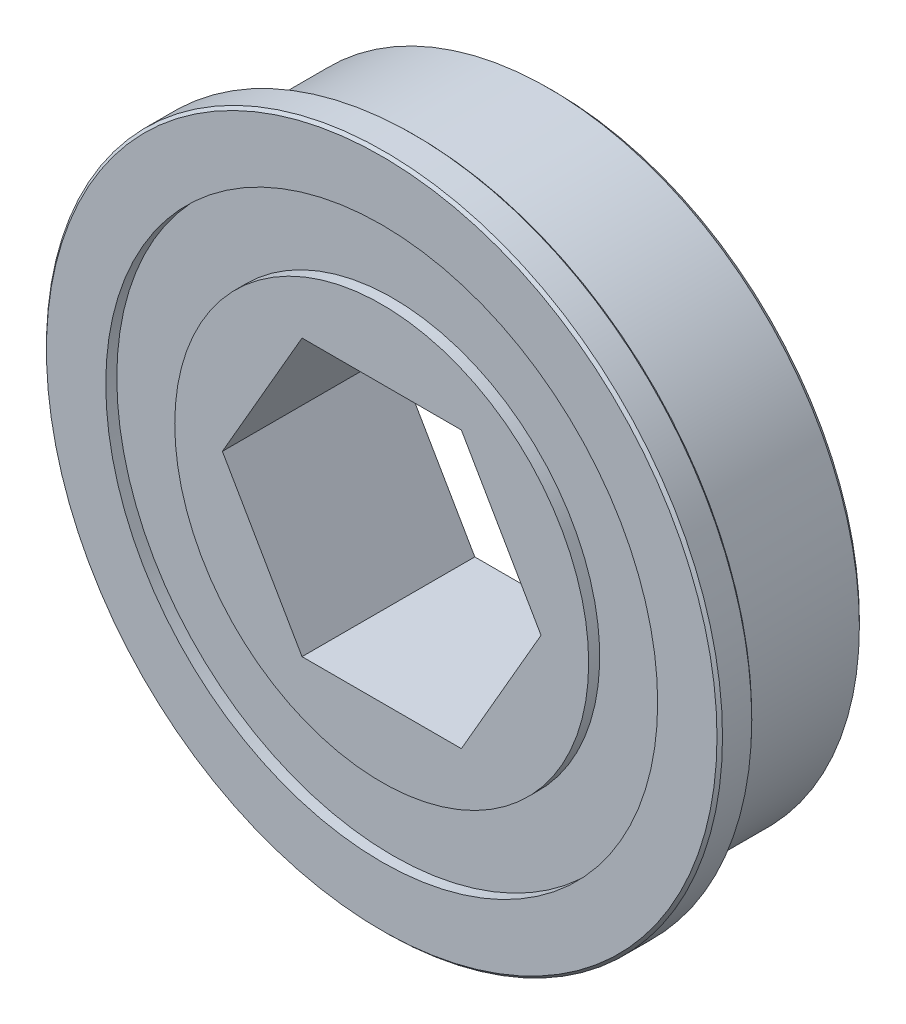
ISO-10303-21;
HEADER;
FILE_DESCRIPTION(('STEP AP214'),'2;1');
FILE_NAME('part.step','',(''),(''),'','','');
FILE_SCHEMA(('AUTOMOTIVE_DESIGN { 1 0 10303 214 1 1 1 1 }'));
ENDSEC;
DATA;
#1=APPLICATION_CONTEXT('core data for automotive mechanical design processes');
#2=APPLICATION_PROTOCOL_DEFINITION('international standard','automotive_design',2000,#1);
#3=PRODUCT_CONTEXT('',#1,'mechanical');
#4=PRODUCT('Part','Part','',(#3));
#5=PRODUCT_RELATED_PRODUCT_CATEGORY('part','',(#4));
#6=PRODUCT_DEFINITION_FORMATION('','',#4);
#7=PRODUCT_DEFINITION_CONTEXT('part definition',#1,'design');
#8=PRODUCT_DEFINITION('design','',#6,#7);
#9=PRODUCT_DEFINITION_SHAPE('','',#8);
#10=(LENGTH_UNIT() NAMED_UNIT(*) SI_UNIT(.MILLI.,.METRE.));
#11=(NAMED_UNIT(*) PLANE_ANGLE_UNIT() SI_UNIT($,.RADIAN.));
#12=(NAMED_UNIT(*) SI_UNIT($,.STERADIAN.) SOLID_ANGLE_UNIT());
#13=UNCERTAINTY_MEASURE_WITH_UNIT(LENGTH_MEASURE(1.E-05),#10,'distance_accuracy_value','');
#14=(GEOMETRIC_REPRESENTATION_CONTEXT(3) GLOBAL_UNCERTAINTY_ASSIGNED_CONTEXT((#13)) GLOBAL_UNIT_ASSIGNED_CONTEXT((#10,
#11,#12)) REPRESENTATION_CONTEXT('',''));
#15=CARTESIAN_POINT('',(0.,0.,0.));
#16=DIRECTION('',(0.,0.,1.));
#17=DIRECTION('',(1.,0.,0.));
#18=AXIS2_PLACEMENT_3D('',#15,#16,#17);
#19=CARTESIAN_POINT('',(0.,0.,-3.975));
#20=DIRECTION('',(0.,0.,1.));
#21=DIRECTION('',(1.,0.,0.));
#22=AXIS2_PLACEMENT_3D('',#19,#20,#21);
#23=CYLINDRICAL_SURFACE('',#22,14.2875);
#24=CARTESIAN_POINT('',(0.,0.,-3.721));
#25=DIRECTION('',(0.,0.,-1.));
#26=DIRECTION('',(-1.,0.,0.));
#27=AXIS2_PLACEMENT_3D('',#24,#25,#26);
#28=CIRCLE('',#27,14.2875);
#29=CARTESIAN_POINT('',(-14.2875,0.,-3.721));
#30=VERTEX_POINT('',#29);
#31=EDGE_CURVE('E57',#30,#30,#28,.F.);
#32=ORIENTED_EDGE('',*,*,#31,.T.);
#33=EDGE_LOOP('',(#32));
#34=FACE_BOUND('',#33,.T.);
#35=CARTESIAN_POINT('',(0.,0.,2.121));
#36=DIRECTION('',(0.,0.,1.));
#37=DIRECTION('',(1.,0.,0.));
#38=AXIS2_PLACEMENT_3D('',#35,#36,#37);
#39=CIRCLE('',#38,14.2875);
#40=CARTESIAN_POINT('',(14.2875,0.,2.121));
#41=VERTEX_POINT('',#40);
#42=EDGE_CURVE('E196',#41,#41,#39,.T.);
#43=ORIENTED_EDGE('',*,*,#42,.F.);
#44=EDGE_LOOP('',(#43));
#45=FACE_BOUND('',#44,.T.);
#46=ADVANCED_FACE('F47',(#34,#45),#23,.T.);
#47=CARTESIAN_POINT('',(14.2875,0.,-3.975));
#48=DIRECTION('',(0.,0.,-1.));
#49=DIRECTION('',(-1.,0.,0.));
#50=AXIS2_PLACEMENT_3D('',#47,#48,#49);
#51=PLANE('',#50);
#52=CARTESIAN_POINT('',(0.,0.,-3.975));
#53=DIRECTION('',(0.,0.,-1.));
#54=DIRECTION('',(-1.,0.,0.));
#55=AXIS2_PLACEMENT_3D('',#52,#53,#54);
#56=CIRCLE('',#55,14.0335);
#57=CARTESIAN_POINT('',(-14.0335,0.,-3.975));
#58=VERTEX_POINT('',#57);
#59=EDGE_CURVE('E11',#58,#58,#56,.T.);
#60=ORIENTED_EDGE('',*,*,#59,.T.);
#61=EDGE_LOOP('',(#60));
#62=FACE_BOUND('',#61,.T.);
#63=CARTESIAN_POINT('',(0.,0.,-3.975));
#64=DIRECTION('',(0.,0.,-1.));
#65=DIRECTION('',(-1.,0.,0.));
#66=AXIS2_PLACEMENT_3D('',#63,#64,#65);
#67=CIRCLE('',#66,12.7);
#68=CARTESIAN_POINT('',(-12.7,0.,-3.975));
#69=VERTEX_POINT('',#68);
#70=EDGE_CURVE('E188',#69,#69,#67,.T.);
#71=ORIENTED_EDGE('',*,*,#70,.F.);
#72=EDGE_LOOP('',(#71));
#73=FACE_BOUND('',#72,.T.);
#74=ADVANCED_FACE('F248',(#62,#73),#51,.T.);
#75=CARTESIAN_POINT('',(0.,0.,3.975));
#76=DIRECTION('',(0.,0.,1.));
#77=DIRECTION('',(1.,0.,0.));
#78=AXIS2_PLACEMENT_3D('',#75,#76,#77);
#79=PLANE('',#78);
#80=CARTESIAN_POINT('',(0.,0.,3.975));
#81=DIRECTION('',(0.,0.,1.));
#82=DIRECTION('',(1.,0.,0.));
#83=AXIS2_PLACEMENT_3D('',#80,#81,#82);
#84=CIRCLE('',#83,15.4305);
#85=CARTESIAN_POINT('',(15.4305,0.,3.975));
#86=VERTEX_POINT('',#85);
#87=EDGE_CURVE('E216',#86,#86,#84,.T.);
#88=ORIENTED_EDGE('',*,*,#87,.T.);
#89=EDGE_LOOP('',(#88));
#90=FACE_BOUND('',#89,.T.);
#91=CARTESIAN_POINT('',(0.,0.,3.975));
#92=DIRECTION('',(0.,0.,1.));
#93=DIRECTION('',(1.,0.,0.));
#94=AXIS2_PLACEMENT_3D('',#91,#92,#93);
#95=CIRCLE('',#94,12.7);
#96=CARTESIAN_POINT('',(12.7,0.,3.975));
#97=VERTEX_POINT('',#96);
#98=EDGE_CURVE('E176',#97,#97,#95,.T.);
#99=ORIENTED_EDGE('',*,*,#98,.F.);
#100=EDGE_LOOP('',(#99));
#101=FACE_BOUND('',#100,.T.);
#102=ADVANCED_FACE('F252',(#90,#101),#79,.T.);
#103=CARTESIAN_POINT('',(0.,0.,-3.975));
#104=DIRECTION('',(0.,0.,1.));
#105=DIRECTION('',(1.,0.,0.));
#106=AXIS2_PLACEMENT_3D('',#103,#104,#105);
#107=CYLINDRICAL_SURFACE('',#106,15.5575);
#108=CARTESIAN_POINT('',(0.,0.,3.848));
#109=DIRECTION('',(0.,0.,1.));
#110=DIRECTION('',(1.,0.,0.));
#111=AXIS2_PLACEMENT_3D('',#108,#109,#110);
#112=CIRCLE('',#111,15.5575);
#113=CARTESIAN_POINT('',(15.5575,0.,3.848));
#114=VERTEX_POINT('',#113);
#115=EDGE_CURVE('E224',#114,#114,#112,.F.);
#116=ORIENTED_EDGE('',*,*,#115,.T.);
#117=EDGE_LOOP('',(#116));
#118=FACE_BOUND('',#117,.T.);
#119=CARTESIAN_POINT('',(0.,0.,2.502));
#120=DIRECTION('',(0.,0.,-1.));
#121=DIRECTION('',(-1.,0.,0.));
#122=AXIS2_PLACEMENT_3D('',#119,#120,#121);
#123=CIRCLE('',#122,15.5575);
#124=CARTESIAN_POINT('',(-15.5575,0.,2.502));
#125=VERTEX_POINT('',#124);
#126=EDGE_CURVE('E220',#125,#125,#123,.F.);
#127=ORIENTED_EDGE('',*,*,#126,.T.);
#128=EDGE_LOOP('',(#127));
#129=FACE_BOUND('',#128,.T.);
#130=ADVANCED_FACE('F279',(#118,#129),#107,.T.);
#131=CARTESIAN_POINT('',(15.5575,0.,2.375));
#132=DIRECTION('',(0.,0.,-1.));
#133=DIRECTION('',(-1.,0.,0.));
#134=AXIS2_PLACEMENT_3D('',#131,#132,#133);
#135=PLANE('',#134);
#136=CARTESIAN_POINT('',(0.,0.,2.375));
#137=DIRECTION('',(0.,0.,-1.));
#138=DIRECTION('',(-1.,0.,0.));
#139=AXIS2_PLACEMENT_3D('',#136,#137,#138);
#140=CIRCLE('',#139,15.4305);
#141=CARTESIAN_POINT('',(-15.4305,0.,2.375));
#142=VERTEX_POINT('',#141);
#143=EDGE_CURVE('E228',#142,#142,#140,.T.);
#144=ORIENTED_EDGE('',*,*,#143,.T.);
#145=EDGE_LOOP('',(#144));
#146=FACE_BOUND('',#145,.T.);
#147=CARTESIAN_POINT('',(0.,0.,2.375));
#148=DIRECTION('',(0.,0.,1.));
#149=DIRECTION('',(1.,0.,0.));
#150=AXIS2_PLACEMENT_3D('',#147,#148,#149);
#151=CIRCLE('',#150,14.1605);
#152=CARTESIAN_POINT('',(14.1605,0.,2.375));
#153=VERTEX_POINT('',#152);
#154=EDGE_CURVE('E204',#153,#153,#151,.T.);
#155=ORIENTED_EDGE('',*,*,#154,.T.);
#156=EDGE_LOOP('',(#155));
#157=FACE_BOUND('',#156,.T.);
#158=ADVANCED_FACE('F321',(#146,#157),#135,.T.);
#159=CARTESIAN_POINT('',(0.,0.,-3.975));
#160=DIRECTION('',(0.,0.,1.));
#161=DIRECTION('',(1.,0.,0.));
#162=AXIS2_PLACEMENT_3D('',#159,#160,#161);
#163=CYLINDRICAL_SURFACE('',#162,14.1605);
#164=CARTESIAN_POINT('',(0.,0.,2.121));
#165=DIRECTION('',(0.,0.,1.));
#166=DIRECTION('',(1.,0.,0.));
#167=AXIS2_PLACEMENT_3D('',#164,#165,#166);
#168=CIRCLE('',#167,14.1605);
#169=CARTESIAN_POINT('',(14.1605,0.,2.121));
#170=VERTEX_POINT('',#169);
#171=EDGE_CURVE('E200',#170,#170,#168,.T.);
#172=ORIENTED_EDGE('',*,*,#171,.T.);
#173=EDGE_LOOP('',(#172));
#174=FACE_BOUND('',#173,.T.);
#175=ORIENTED_EDGE('',*,*,#154,.F.);
#176=EDGE_LOOP('',(#175));
#177=FACE_BOUND('',#176,.T.);
#178=ADVANCED_FACE('F317',(#174,#177),#163,.T.);
#179=CARTESIAN_POINT('',(14.1605,0.,2.121));
#180=DIRECTION('',(0.,0.,1.));
#181=DIRECTION('',(1.,0.,0.));
#182=AXIS2_PLACEMENT_3D('',#179,#180,#181);
#183=PLANE('',#182);
#184=ORIENTED_EDGE('',*,*,#42,.T.);
#185=EDGE_LOOP('',(#184));
#186=FACE_BOUND('',#185,.T.);
#187=ORIENTED_EDGE('',*,*,#171,.F.);
#188=EDGE_LOOP('',(#187));
#189=FACE_BOUND('',#188,.T.);
#190=ADVANCED_FACE('F313',(#186,#189),#183,.T.);
#191=CARTESIAN_POINT('',(0.,0.,-3.46700000000002));
#192=DIRECTION('',(0.,0.,1.));
#193=DIRECTION('',(1.,0.,0.));
#194=AXIS2_PLACEMENT_3D('',#191,#192,#193);
#195=PLANE('',#194);
#196=CARTESIAN_POINT('',(0.,0.,-3.46700000000002));
#197=DIRECTION('',(0.,0.,1.));
#198=DIRECTION('',(1.,0.,0.));
#199=AXIS2_PLACEMENT_3D('',#196,#197,#198);
#200=CIRCLE('',#199,9.525);
#201=CARTESIAN_POINT('',(9.525,0.,-3.46700000000002));
#202=VERTEX_POINT('',#201);
#203=EDGE_CURVE('E208',#202,#202,#200,.F.);
#204=ORIENTED_EDGE('',*,*,#203,.F.);
#205=EDGE_LOOP('',(#204));
#206=FACE_BOUND('',#205,.T.);
#207=CARTESIAN_POINT('',(0.,0.,-3.467));
#208=DIRECTION('',(0.,0.,-1.));
#209=DIRECTION('',(-1.,0.,0.));
#210=AXIS2_PLACEMENT_3D('',#207,#208,#209);
#211=CIRCLE('',#210,12.7);
#212=CARTESIAN_POINT('',(-12.7,0.,-3.467));
#213=VERTEX_POINT('',#212);
#214=EDGE_CURVE('E192',#213,#213,#211,.T.);
#215=ORIENTED_EDGE('',*,*,#214,.T.);
#216=EDGE_LOOP('',(#215));
#217=FACE_BOUND('',#216,.T.);
#218=ADVANCED_FACE('F309',(#206,#217),#195,.F.);
#219=CARTESIAN_POINT('',(0.,0.,-3.975));
#220=DIRECTION('',(0.,0.,-1.));
#221=DIRECTION('',(-1.,0.,0.));
#222=AXIS2_PLACEMENT_3D('',#219,#220,#221);
#223=CYLINDRICAL_SURFACE('',#222,12.7);
#224=ORIENTED_EDGE('',*,*,#214,.F.);
#225=EDGE_LOOP('',(#224));
#226=FACE_BOUND('',#225,.T.);
#227=ORIENTED_EDGE('',*,*,#70,.T.);
#228=EDGE_LOOP('',(#227));
#229=FACE_BOUND('',#228,.T.);
#230=ADVANCED_FACE('F305',(#226,#229),#223,.F.);
#231=CARTESIAN_POINT('',(0.,0.,-3.97500000000003));
#232=DIRECTION('',(0.,0.,1.));
#233=DIRECTION('',(1.,0.,0.));
#234=AXIS2_PLACEMENT_3D('',#231,#232,#233);
#235=CYLINDRICAL_SURFACE('',#234,9.525);
#236=CARTESIAN_POINT('',(0.,0.,-3.97500000000003));
#237=DIRECTION('',(0.,0.,-1.));
#238=DIRECTION('',(-1.,0.,0.));
#239=AXIS2_PLACEMENT_3D('',#236,#237,#238);
#240=CIRCLE('',#239,9.525);
#241=CARTESIAN_POINT('',(-9.525,0.,-3.97500000000003));
#242=VERTEX_POINT('',#241);
#243=EDGE_CURVE('E184',#242,#242,#240,.T.);
#244=ORIENTED_EDGE('',*,*,#243,.F.);
#245=EDGE_LOOP('',(#244));
#246=FACE_BOUND('',#245,.T.);
#247=ORIENTED_EDGE('',*,*,#203,.T.);
#248=EDGE_LOOP('',(#247));
#249=FACE_BOUND('',#248,.T.);
#250=ADVANCED_FACE('F303',(#246,#249),#235,.T.);
#251=CARTESIAN_POINT('',(0.,0.,-3.97500000000003));
#252=DIRECTION('',(0.,0.,-1.));
#253=DIRECTION('',(-1.,0.,0.));
#254=AXIS2_PLACEMENT_3D('',#251,#252,#253);
#255=PLANE('',#254);
#256=DIRECTION('',(-0.500000000000001,0.866025403784438,0.));
#257=VECTOR('',#256,1.);
#258=CARTESIAN_POINT('',(7.33234841870825,0.,-3.97500000000003));
#259=LINE('',#258,#257);
#260=CARTESIAN_POINT('',(7.33234841870825,0.,-3.97500000000003));
#261=VERTEX_POINT('',#260);
#262=CARTESIAN_POINT('',(3.66617420935412,6.35,-3.97500000000003));
#263=VERTEX_POINT('',#262);
#264=EDGE_CURVE('E104',#261,#263,#259,.T.);
#265=ORIENTED_EDGE('',*,*,#264,.T.);
#266=DIRECTION('',(-1.,0.,0.));
#267=VECTOR('',#266,1.);
#268=CARTESIAN_POINT('',(3.66617420935412,6.35,-3.97500000000003));
#269=LINE('',#268,#267);
#270=CARTESIAN_POINT('',(-3.66617420935412,6.35,-3.97500000000003));
#271=VERTEX_POINT('',#270);
#272=EDGE_CURVE('E114',#263,#271,#269,.T.);
#273=ORIENTED_EDGE('',*,*,#272,.T.);
#274=DIRECTION('',(-0.5,-0.866025403784439,0.));
#275=VECTOR('',#274,1.);
#276=CARTESIAN_POINT('',(-3.66617420935412,6.35,-3.97500000000003));
#277=LINE('',#276,#275);
#278=CARTESIAN_POINT('',(-7.33234841870825,0.,-3.97500000000003));
#279=VERTEX_POINT('',#278);
#280=EDGE_CURVE('E64',#271,#279,#277,.T.);
#281=ORIENTED_EDGE('',*,*,#280,.T.);
#282=DIRECTION('',(0.500000000000001,-0.866025403784438,0.));
#283=VECTOR('',#282,1.);
#284=CARTESIAN_POINT('',(-7.33234841870825,0.,-3.97500000000003));
#285=LINE('',#284,#283);
#286=CARTESIAN_POINT('',(-3.66617420935412,-6.35,-3.97500000000003));
#287=VERTEX_POINT('',#286);
#288=EDGE_CURVE('E133',#279,#287,#285,.T.);
#289=ORIENTED_EDGE('',*,*,#288,.T.);
#290=DIRECTION('',(1.,0.,0.));
#291=VECTOR('',#290,1.);
#292=CARTESIAN_POINT('',(-3.66617420935412,-6.35,-3.97500000000003));
#293=LINE('',#292,#291);
#294=CARTESIAN_POINT('',(3.66617420935412,-6.35,-3.97500000000003));
#295=VERTEX_POINT('',#294);
#296=EDGE_CURVE('E137',#287,#295,#293,.T.);
#297=ORIENTED_EDGE('',*,*,#296,.T.);
#298=DIRECTION('',(0.5,0.866025403784439,0.));
#299=VECTOR('',#298,1.);
#300=CARTESIAN_POINT('',(3.66617420935412,-6.35,-3.97500000000003));
#301=LINE('',#300,#299);
#302=EDGE_CURVE('E111',#295,#261,#301,.T.);
#303=ORIENTED_EDGE('',*,*,#302,.T.);
#304=EDGE_LOOP('',(#265,#273,#281,#289,#297,#303));
#305=FACE_BOUND('',#304,.T.);
#306=ORIENTED_EDGE('',*,*,#243,.T.);
#307=EDGE_LOOP('',(#306));
#308=FACE_BOUND('',#307,.T.);
#309=ADVANCED_FACE('F119',(#305,#308),#255,.T.);
#310=CARTESIAN_POINT('',(0.,0.,3.46700000000002));
#311=DIRECTION('',(0.,0.,-1.));
#312=DIRECTION('',(-1.,0.,0.));
#313=AXIS2_PLACEMENT_3D('',#310,#311,#312);
#314=PLANE('',#313);
#315=CARTESIAN_POINT('',(0.,0.,3.46700000000002));
#316=DIRECTION('',(0.,0.,-1.));
#317=DIRECTION('',(-1.,0.,0.));
#318=AXIS2_PLACEMENT_3D('',#315,#316,#317);
#319=CIRCLE('',#318,9.525);
#320=CARTESIAN_POINT('',(-9.525,0.,3.46700000000002));
#321=VERTEX_POINT('',#320);
#322=EDGE_CURVE('E212',#321,#321,#319,.F.);
#323=ORIENTED_EDGE('',*,*,#322,.F.);
#324=EDGE_LOOP('',(#323));
#325=FACE_BOUND('',#324,.T.);
#326=CARTESIAN_POINT('',(0.,0.,3.467));
#327=DIRECTION('',(0.,0.,1.));
#328=DIRECTION('',(1.,0.,0.));
#329=AXIS2_PLACEMENT_3D('',#326,#327,#328);
#330=CIRCLE('',#329,12.7);
#331=CARTESIAN_POINT('',(12.7,0.,3.467));
#332=VERTEX_POINT('',#331);
#333=EDGE_CURVE('E180',#332,#332,#330,.T.);
#334=ORIENTED_EDGE('',*,*,#333,.T.);
#335=EDGE_LOOP('',(#334));
#336=FACE_BOUND('',#335,.T.);
#337=ADVANCED_FACE('F285',(#325,#336),#314,.F.);
#338=CARTESIAN_POINT('',(0.,0.,3.975));
#339=DIRECTION('',(0.,0.,1.));
#340=DIRECTION('',(1.,0.,0.));
#341=AXIS2_PLACEMENT_3D('',#338,#339,#340);
#342=CYLINDRICAL_SURFACE('',#341,12.7);
#343=ORIENTED_EDGE('',*,*,#333,.F.);
#344=EDGE_LOOP('',(#343));
#345=FACE_BOUND('',#344,.T.);
#346=ORIENTED_EDGE('',*,*,#98,.T.);
#347=EDGE_LOOP('',(#346));
#348=FACE_BOUND('',#347,.T.);
#349=ADVANCED_FACE('F282',(#345,#348),#342,.F.);
#350=CARTESIAN_POINT('',(0.,0.,3.97500000000003));
#351=DIRECTION('',(0.,0.,-1.));
#352=DIRECTION('',(-1.,0.,0.));
#353=AXIS2_PLACEMENT_3D('',#350,#351,#352);
#354=CYLINDRICAL_SURFACE('',#353,9.525);
#355=CARTESIAN_POINT('',(0.,0.,3.97500000000003));
#356=DIRECTION('',(0.,0.,1.));
#357=DIRECTION('',(1.,0.,0.));
#358=AXIS2_PLACEMENT_3D('',#355,#356,#357);
#359=CIRCLE('',#358,9.525);
#360=CARTESIAN_POINT('',(9.525,0.,3.97500000000003));
#361=VERTEX_POINT('',#360);
#362=EDGE_CURVE('E161',#361,#361,#359,.T.);
#363=ORIENTED_EDGE('',*,*,#362,.F.);
#364=EDGE_LOOP('',(#363));
#365=FACE_BOUND('',#364,.T.);
#366=ORIENTED_EDGE('',*,*,#322,.T.);
#367=EDGE_LOOP('',(#366));
#368=FACE_BOUND('',#367,.T.);
#369=ADVANCED_FACE('F284',(#365,#368),#354,.T.);
#370=CARTESIAN_POINT('',(0.,0.,3.97500000000003));
#371=DIRECTION('',(0.,0.,1.));
#372=DIRECTION('',(1.,0.,0.));
#373=AXIS2_PLACEMENT_3D('',#370,#371,#372);
#374=PLANE('',#373);
#375=DIRECTION('',(-0.500000000000001,0.866025403784438,0.));
#376=VECTOR('',#375,1.);
#377=CARTESIAN_POINT('',(7.33234841870825,0.,3.97500000000003));
#378=LINE('',#377,#376);
#379=CARTESIAN_POINT('',(7.33234841870825,0.,3.97500000000003));
#380=VERTEX_POINT('',#379);
#381=CARTESIAN_POINT('',(3.66617420935412,6.35,3.97500000000003));
#382=VERTEX_POINT('',#381);
#383=EDGE_CURVE('E72',#380,#382,#378,.T.);
#384=ORIENTED_EDGE('',*,*,#383,.F.);
#385=DIRECTION('',(0.5,0.866025403784439,0.));
#386=VECTOR('',#385,1.);
#387=CARTESIAN_POINT('',(3.66617420935412,-6.35,3.97500000000003));
#388=LINE('',#387,#386);
#389=CARTESIAN_POINT('',(3.66617420935412,-6.35,3.97500000000003));
#390=VERTEX_POINT('',#389);
#391=EDGE_CURVE('E124',#390,#380,#388,.T.);
#392=ORIENTED_EDGE('',*,*,#391,.F.);
#393=DIRECTION('',(1.,0.,0.));
#394=VECTOR('',#393,1.);
#395=CARTESIAN_POINT('',(-3.66617420935412,-6.35,3.97500000000003));
#396=LINE('',#395,#394);
#397=CARTESIAN_POINT('',(-3.66617420935412,-6.35,3.97500000000003));
#398=VERTEX_POINT('',#397);
#399=EDGE_CURVE('E128',#398,#390,#396,.T.);
#400=ORIENTED_EDGE('',*,*,#399,.F.);
#401=DIRECTION('',(0.500000000000001,-0.866025403784438,0.));
#402=VECTOR('',#401,1.);
#403=CARTESIAN_POINT('',(-7.33234841870825,0.,3.97500000000003));
#404=LINE('',#403,#402);
#405=CARTESIAN_POINT('',(-7.33234841870825,0.,3.97500000000003));
#406=VERTEX_POINT('',#405);
#407=EDGE_CURVE('E151',#406,#398,#404,.T.);
#408=ORIENTED_EDGE('',*,*,#407,.F.);
#409=DIRECTION('',(-0.5,-0.866025403784439,0.));
#410=VECTOR('',#409,1.);
#411=CARTESIAN_POINT('',(-3.66617420935412,6.35,3.97500000000003));
#412=LINE('',#411,#410);
#413=CARTESIAN_POINT('',(-3.66617420935412,6.35,3.97500000000003));
#414=VERTEX_POINT('',#413);
#415=EDGE_CURVE('E147',#414,#406,#412,.T.);
#416=ORIENTED_EDGE('',*,*,#415,.F.);
#417=DIRECTION('',(-1.,0.,0.));
#418=VECTOR('',#417,1.);
#419=CARTESIAN_POINT('',(3.66617420935412,6.35,3.97500000000003));
#420=LINE('',#419,#418);
#421=EDGE_CURVE('E144',#382,#414,#420,.T.);
#422=ORIENTED_EDGE('',*,*,#421,.F.);
#423=EDGE_LOOP('',(#384,#392,#400,#408,#416,#422));
#424=FACE_BOUND('',#423,.T.);
#425=ORIENTED_EDGE('',*,*,#362,.T.);
#426=EDGE_LOOP('',(#425));
#427=FACE_BOUND('',#426,.T.);
#428=ADVANCED_FACE('F293',(#424,#427),#374,.T.);
#429=CARTESIAN_POINT('',(7.33234841870825,0.,-3.97500000000003));
#430=DIRECTION('',(0.866025403784438,0.500000000000001,0.));
#431=DIRECTION('',(-0.500000000000001,0.866025403784438,0.));
#432=AXIS2_PLACEMENT_3D('',#429,#430,#431);
#433=PLANE('',#432);
#434=ORIENTED_EDGE('',*,*,#383,.T.);
#435=DIRECTION('',(0.,0.,1.));
#436=VECTOR('',#435,1.);
#437=CARTESIAN_POINT('',(3.66617420935412,6.35,-3.97500000000003));
#438=LINE('',#437,#436);
#439=EDGE_CURVE('E100',#263,#382,#438,.T.);
#440=ORIENTED_EDGE('',*,*,#439,.F.);
#441=ORIENTED_EDGE('',*,*,#264,.F.);
#442=DIRECTION('',(0.,0.,1.));
#443=VECTOR('',#442,1.);
#444=CARTESIAN_POINT('',(7.33234841870825,0.,-3.97500000000003));
#445=LINE('',#444,#443);
#446=EDGE_CURVE('E158',#261,#380,#445,.T.);
#447=ORIENTED_EDGE('',*,*,#446,.T.);
#448=EDGE_LOOP('',(#434,#440,#441,#447));
#449=FACE_BOUND('',#448,.T.);
#450=ADVANCED_FACE('F102',(#449),#433,.F.);
#451=CARTESIAN_POINT('',(3.66617420935412,-6.35,-3.97500000000003));
#452=DIRECTION('',(0.866025403784439,-0.5,0.));
#453=DIRECTION('',(0.5,0.866025403784439,0.));
#454=AXIS2_PLACEMENT_3D('',#451,#452,#453);
#455=PLANE('',#454);
#456=ORIENTED_EDGE('',*,*,#391,.T.);
#457=ORIENTED_EDGE('',*,*,#446,.F.);
#458=ORIENTED_EDGE('',*,*,#302,.F.);
#459=DIRECTION('',(0.,0.,1.));
#460=VECTOR('',#459,1.);
#461=CARTESIAN_POINT('',(3.66617420935412,-6.35,-3.97500000000003));
#462=LINE('',#461,#460);
#463=EDGE_CURVE('E162',#295,#390,#462,.T.);
#464=ORIENTED_EDGE('',*,*,#463,.T.);
#465=EDGE_LOOP('',(#456,#457,#458,#464));
#466=FACE_BOUND('',#465,.T.);
#467=ADVANCED_FACE('F409',(#466),#455,.F.);
#468=CARTESIAN_POINT('',(-3.66617420935412,-6.35,-3.97500000000003));
#469=DIRECTION('',(0.,-1.,0.));
#470=DIRECTION('',(0.,0.,-1.));
#471=AXIS2_PLACEMENT_3D('',#468,#469,#470);
#472=PLANE('',#471);
#473=ORIENTED_EDGE('',*,*,#399,.T.);
#474=ORIENTED_EDGE('',*,*,#463,.F.);
#475=ORIENTED_EDGE('',*,*,#296,.F.);
#476=DIRECTION('',(0.,0.,1.));
#477=VECTOR('',#476,1.);
#478=CARTESIAN_POINT('',(-3.66617420935412,-6.35,-3.97500000000003));
#479=LINE('',#478,#477);
#480=EDGE_CURVE('E165',#287,#398,#479,.T.);
#481=ORIENTED_EDGE('',*,*,#480,.T.);
#482=EDGE_LOOP('',(#473,#474,#475,#481));
#483=FACE_BOUND('',#482,.T.);
#484=ADVANCED_FACE('F418',(#483),#472,.F.);
#485=CARTESIAN_POINT('',(-7.33234841870825,0.,-3.97500000000003));
#486=DIRECTION('',(-0.866025403784438,-0.500000000000001,0.));
#487=DIRECTION('',(0.500000000000001,-0.866025403784438,0.));
#488=AXIS2_PLACEMENT_3D('',#485,#486,#487);
#489=PLANE('',#488);
#490=ORIENTED_EDGE('',*,*,#407,.T.);
#491=ORIENTED_EDGE('',*,*,#480,.F.);
#492=ORIENTED_EDGE('',*,*,#288,.F.);
#493=DIRECTION('',(0.,0.,1.));
#494=VECTOR('',#493,1.);
#495=CARTESIAN_POINT('',(-7.33234841870825,0.,-3.97500000000003));
#496=LINE('',#495,#494);
#497=EDGE_CURVE('E168',#279,#406,#496,.T.);
#498=ORIENTED_EDGE('',*,*,#497,.T.);
#499=EDGE_LOOP('',(#490,#491,#492,#498));
#500=FACE_BOUND('',#499,.T.);
#501=ADVANCED_FACE('F428',(#500),#489,.F.);
#502=CARTESIAN_POINT('',(-3.66617420935412,6.35,-3.97500000000003));
#503=DIRECTION('',(-0.866025403784439,0.5,0.));
#504=DIRECTION('',(-0.5,-0.866025403784439,0.));
#505=AXIS2_PLACEMENT_3D('',#502,#503,#504);
#506=PLANE('',#505);
#507=ORIENTED_EDGE('',*,*,#415,.T.);
#508=ORIENTED_EDGE('',*,*,#497,.F.);
#509=ORIENTED_EDGE('',*,*,#280,.F.);
#510=DIRECTION('',(0.,0.,1.));
#511=VECTOR('',#510,1.);
#512=CARTESIAN_POINT('',(-3.66617420935412,6.35,-3.97500000000003));
#513=LINE('',#512,#511);
#514=EDGE_CURVE('E110',#271,#414,#513,.T.);
#515=ORIENTED_EDGE('',*,*,#514,.T.);
#516=EDGE_LOOP('',(#507,#508,#509,#515));
#517=FACE_BOUND('',#516,.T.);
#518=ADVANCED_FACE('F271',(#517),#506,.F.);
#519=CARTESIAN_POINT('',(3.66617420935412,6.35,-3.97500000000003));
#520=DIRECTION('',(0.,1.,0.));
#521=DIRECTION('',(0.,0.,1.));
#522=AXIS2_PLACEMENT_3D('',#519,#520,#521);
#523=PLANE('',#522);
#524=ORIENTED_EDGE('',*,*,#421,.T.);
#525=ORIENTED_EDGE('',*,*,#514,.F.);
#526=ORIENTED_EDGE('',*,*,#272,.F.);
#527=ORIENTED_EDGE('',*,*,#439,.T.);
#528=EDGE_LOOP('',(#524,#525,#526,#527));
#529=FACE_BOUND('',#528,.T.);
#530=ADVANCED_FACE('F115',(#529),#523,.F.);
#531=CARTESIAN_POINT('',(0.,0.,3.975));
#532=DIRECTION('',(0.,0.,-1.));
#533=DIRECTION('',(-1.,0.,0.));
#534=AXIS2_PLACEMENT_3D('',#531,#532,#533);
#535=CONICAL_SURFACE('',#534,15.4305,0.785398163397435);
#536=ORIENTED_EDGE('',*,*,#115,.F.);
#537=EDGE_LOOP('',(#536));
#538=FACE_BOUND('',#537,.T.);
#539=ORIENTED_EDGE('',*,*,#87,.F.);
#540=EDGE_LOOP('',(#539));
#541=FACE_BOUND('',#540,.T.);
#542=ADVANCED_FACE('F244',(#538,#541),#535,.T.);
#543=CARTESIAN_POINT('',(0.,0.,2.502));
#544=DIRECTION('',(0.,0.,1.));
#545=DIRECTION('',(1.,0.,0.));
#546=AXIS2_PLACEMENT_3D('',#543,#544,#545);
#547=CONICAL_SURFACE('',#546,15.5575,0.785398163397462);
#548=ORIENTED_EDGE('',*,*,#143,.F.);
#549=EDGE_LOOP('',(#548));
#550=FACE_BOUND('',#549,.T.);
#551=ORIENTED_EDGE('',*,*,#126,.F.);
#552=EDGE_LOOP('',(#551));
#553=FACE_BOUND('',#552,.T.);
#554=ADVANCED_FACE('F238',(#550,#553),#547,.T.);
#555=CARTESIAN_POINT('',(0.,0.,-3.721));
#556=DIRECTION('',(0.,0.,1.));
#557=DIRECTION('',(1.,0.,0.));
#558=AXIS2_PLACEMENT_3D('',#555,#556,#557);
#559=CONICAL_SURFACE('',#558,14.2875,0.785398163397458);
#560=ORIENTED_EDGE('',*,*,#59,.F.);
#561=EDGE_LOOP('',(#560));
#562=FACE_BOUND('',#561,.T.);
#563=ORIENTED_EDGE('',*,*,#31,.F.);
#564=EDGE_LOOP('',(#563));
#565=FACE_BOUND('',#564,.T.);
#566=ADVANCED_FACE('F50',(#562,#565),#559,.T.);
#567=CLOSED_SHELL('',(#46,#74,#102,#130,#158,#178,#190,#218,#230,#250,#309,#337,#349,#369,#428,
#450,#467,#484,#501,#518,#530,#542,#554,#566));
#568=MANIFOLD_SOLID_BREP('B2',#567);
#569=ADVANCED_BREP_SHAPE_REPRESENTATION('',(#18,#568),#14);
#570=SHAPE_DEFINITION_REPRESENTATION(#9,#569);
ENDSEC;
END-ISO-10303-21;
